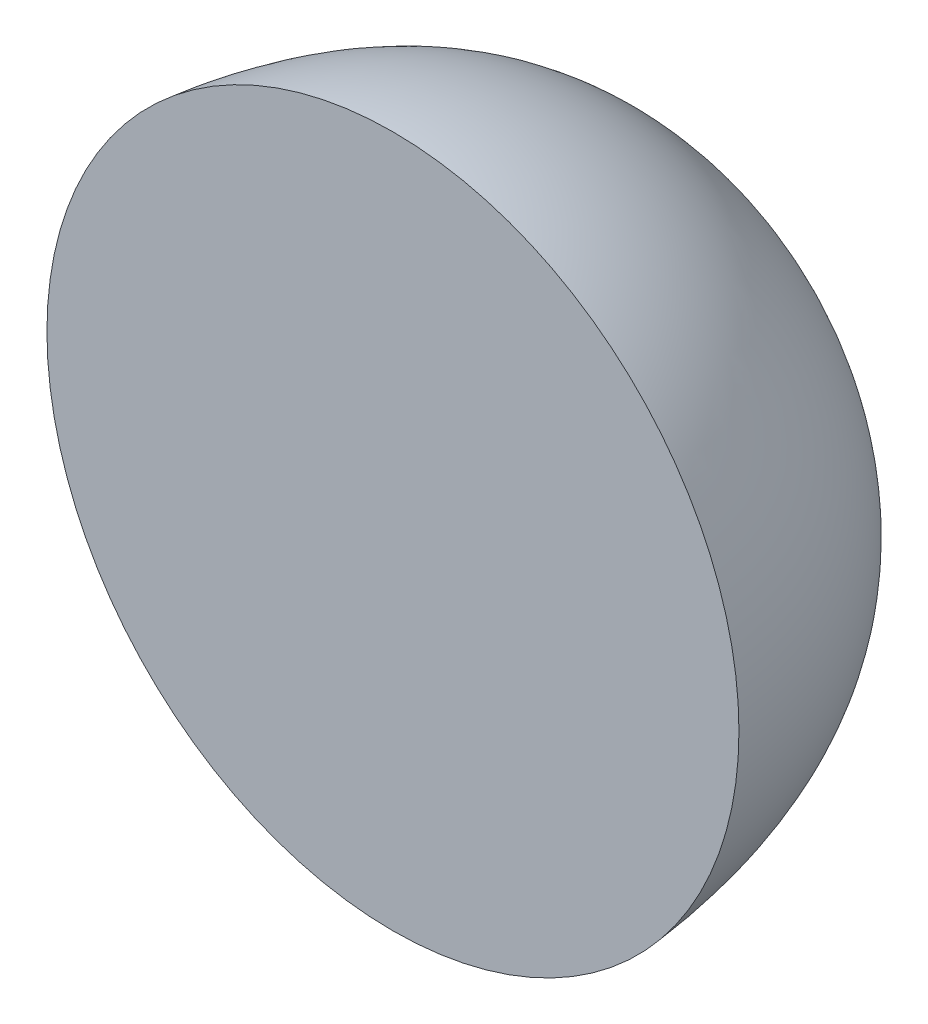
ISO-10303-21;
HEADER;
FILE_DESCRIPTION(('STEP AP214'),'2;1');
FILE_NAME('part.step','',(''),(''),'','','');
FILE_SCHEMA(('AUTOMOTIVE_DESIGN { 1 0 10303 214 1 1 1 1 }'));
ENDSEC;
DATA;
#1=APPLICATION_CONTEXT('core data for automotive mechanical design processes');
#2=APPLICATION_PROTOCOL_DEFINITION('international standard','automotive_design',2000,#1);
#3=PRODUCT_CONTEXT('',#1,'mechanical');
#4=PRODUCT('Part','Part','',(#3));
#5=PRODUCT_RELATED_PRODUCT_CATEGORY('part','',(#4));
#6=PRODUCT_DEFINITION_FORMATION('','',#4);
#7=PRODUCT_DEFINITION_CONTEXT('part definition',#1,'design');
#8=PRODUCT_DEFINITION('design','',#6,#7);
#9=PRODUCT_DEFINITION_SHAPE('','',#8);
#10=(LENGTH_UNIT() NAMED_UNIT(*) SI_UNIT(.MILLI.,.METRE.));
#11=(NAMED_UNIT(*) PLANE_ANGLE_UNIT() SI_UNIT($,.RADIAN.));
#12=(NAMED_UNIT(*) SI_UNIT($,.STERADIAN.) SOLID_ANGLE_UNIT());
#13=UNCERTAINTY_MEASURE_WITH_UNIT(LENGTH_MEASURE(1.E-05),#10,'distance_accuracy_value','');
#14=(GEOMETRIC_REPRESENTATION_CONTEXT(3) GLOBAL_UNCERTAINTY_ASSIGNED_CONTEXT((#13)) GLOBAL_UNIT_ASSIGNED_CONTEXT((#10,
#11,#12)) REPRESENTATION_CONTEXT('',''));
#15=CARTESIAN_POINT('',(0.,0.,0.));
#16=DIRECTION('',(0.,0.,1.));
#17=DIRECTION('',(1.,0.,0.));
#18=AXIS2_PLACEMENT_3D('',#15,#16,#17);
#19=CARTESIAN_POINT('',(21.5,0.,0.));
#20=DIRECTION('',(0.,0.,1.));
#21=DIRECTION('',(1.,0.,0.));
#22=AXIS2_PLACEMENT_3D('',#19,#20,#21);
#23=PLANE('',#22);
#24=CARTESIAN_POINT('',(0.,0.,0.));
#25=DIRECTION('',(0.,0.,1.));
#26=DIRECTION('',(1.,0.,0.));
#27=AXIS2_PLACEMENT_3D('',#24,#25,#26);
#28=CIRCLE('',#27,21.5);
#29=CARTESIAN_POINT('',(21.5,0.,0.));
#30=VERTEX_POINT('',#29);
#31=EDGE_CURVE('E11',#30,#30,#28,.T.);
#32=ORIENTED_EDGE('',*,*,#31,.T.);
#33=EDGE_LOOP('',(#32));
#34=FACE_BOUND('',#33,.T.);
#35=ADVANCED_FACE('F41',(#34),#23,.T.);
#36=CARTESIAN_POINT('',(21.5,0.,0.));
#37=CARTESIAN_POINT('',(19.3595019922771,0.,-20.5347245685766));
#38=CARTESIAN_POINT('',(0.,0.,-20.));
#39=B_SPLINE_CURVE_WITH_KNOTS('',2,(#36,#37,#38),.UNSPECIFIED.,.F.,.F.,(3,3),(0.,1.),.UNSPECIFIED.);
#40=CARTESIAN_POINT('',(0.,0.,0.));
#41=DIRECTION('',(0.,0.,1.));
#42=AXIS1_PLACEMENT('',#40,#41);
#43=SURFACE_OF_REVOLUTION('',#39,#42);
#44=CARTESIAN_POINT('',(0.,0.,-20.));
#45=VERTEX_POINT('',#44);
#46=VERTEX_LOOP('',#45);
#47=FACE_BOUND('',#46,.T.);
#48=ORIENTED_EDGE('',*,*,#31,.F.);
#49=EDGE_LOOP('',(#48));
#50=FACE_BOUND('',#49,.T.);
#51=ADVANCED_FACE('F49',(#47,#50),#43,.F.);
#52=CLOSED_SHELL('',(#35,#51));
#53=MANIFOLD_SOLID_BREP('B2',#52);
#54=ADVANCED_BREP_SHAPE_REPRESENTATION('',(#18,#53),#14);
#55=SHAPE_DEFINITION_REPRESENTATION(#9,#54);
ENDSEC;
END-ISO-10303-21;
